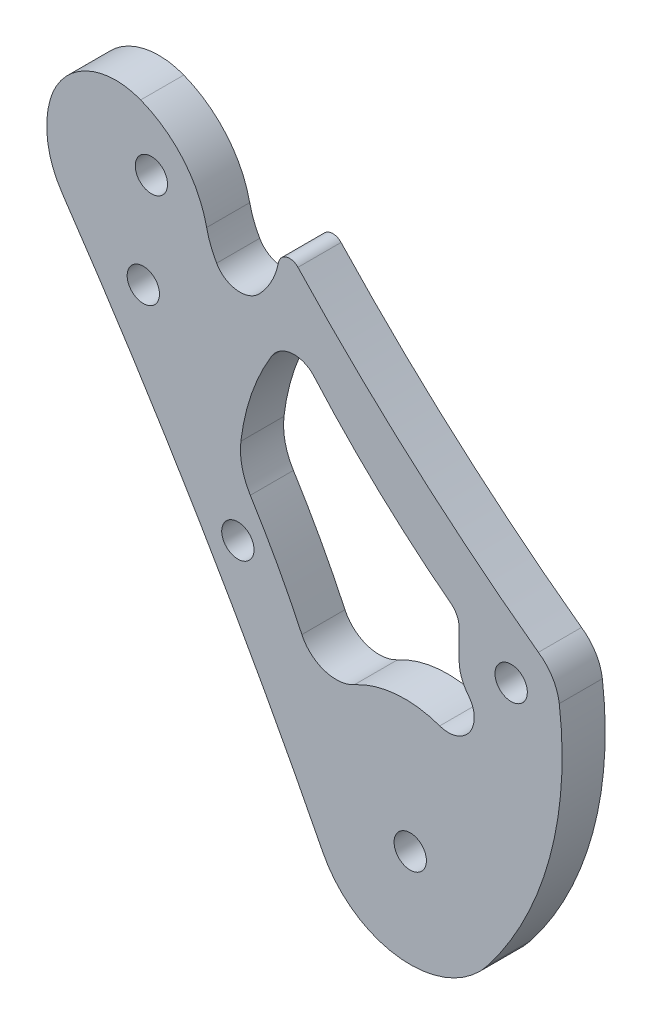
ISO-10303-21;
HEADER;
FILE_DESCRIPTION(('STEP AP214'),'2;1');
FILE_NAME('part.step','',(''),(''),'','','');
FILE_SCHEMA(('AUTOMOTIVE_DESIGN { 1 0 10303 214 1 1 1 1 }'));
ENDSEC;
DATA;
#1=APPLICATION_CONTEXT('core data for automotive mechanical design processes');
#2=APPLICATION_PROTOCOL_DEFINITION('international standard','automotive_design',2000,#1);
#3=PRODUCT_CONTEXT('',#1,'mechanical');
#4=PRODUCT('Part','Part','',(#3));
#5=PRODUCT_RELATED_PRODUCT_CATEGORY('part','',(#4));
#6=PRODUCT_DEFINITION_FORMATION('','',#4);
#7=PRODUCT_DEFINITION_CONTEXT('part definition',#1,'design');
#8=PRODUCT_DEFINITION('design','',#6,#7);
#9=PRODUCT_DEFINITION_SHAPE('','',#8);
#10=(LENGTH_UNIT() NAMED_UNIT(*) SI_UNIT(.MILLI.,.METRE.));
#11=(NAMED_UNIT(*) PLANE_ANGLE_UNIT() SI_UNIT($,.RADIAN.));
#12=(NAMED_UNIT(*) SI_UNIT($,.STERADIAN.) SOLID_ANGLE_UNIT());
#13=UNCERTAINTY_MEASURE_WITH_UNIT(LENGTH_MEASURE(1.E-05),#10,'distance_accuracy_value','');
#14=(GEOMETRIC_REPRESENTATION_CONTEXT(3) GLOBAL_UNCERTAINTY_ASSIGNED_CONTEXT((#13)) GLOBAL_UNIT_ASSIGNED_CONTEXT((#10,
#11,#12)) REPRESENTATION_CONTEXT('',''));
#15=CARTESIAN_POINT('',(0.,0.,0.));
#16=DIRECTION('',(0.,0.,1.));
#17=DIRECTION('',(1.,0.,0.));
#18=AXIS2_PLACEMENT_3D('',#15,#16,#17);
#19=CARTESIAN_POINT('',(65.9573973429245,54.9204086628335,4.));
#20=DIRECTION('',(0.,0.,-1.));
#21=DIRECTION('',(-1.,0.,0.));
#22=AXIS2_PLACEMENT_3D('',#19,#20,#21);
#23=PLANE('',#22);
#24=CARTESIAN_POINT('',(76.3123714532048,30.2000942948942,4.));
#25=DIRECTION('',(0.,0.,1.));
#26=DIRECTION('',(1.,0.,0.));
#27=AXIS2_PLACEMENT_3D('',#24,#25,#26);
#28=CIRCLE('',#27,1.5);
#29=CARTESIAN_POINT('',(77.8123714532048,30.2000942948942,4.));
#30=VERTEX_POINT('',#29);
#31=EDGE_CURVE('E239',#30,#30,#28,.T.);
#32=ORIENTED_EDGE('',*,*,#31,.F.);
#33=EDGE_LOOP('',(#32));
#34=FACE_BOUND('',#33,.T.);
#35=CARTESIAN_POINT('',(67.5354671080567,46.360427952564,4.));
#36=DIRECTION('',(0.,0.,1.));
#37=DIRECTION('',(1.,0.,0.));
#38=AXIS2_PLACEMENT_3D('',#35,#36,#37);
#39=CIRCLE('',#38,1.50110642000384);
#40=CARTESIAN_POINT('',(69.0365735280606,46.360427952564,4.));
#41=VERTEX_POINT('',#40);
#42=EDGE_CURVE('E284',#41,#41,#39,.T.);
#43=ORIENTED_EDGE('',*,*,#42,.F.);
#44=EDGE_LOOP('',(#43));
#45=FACE_BOUND('',#44,.T.);
#46=CARTESIAN_POINT('',(92.3123714532048,13.2000942948942,4.));
#47=DIRECTION('',(0.,0.,1.));
#48=DIRECTION('',(1.,0.,0.));
#49=AXIS2_PLACEMENT_3D('',#46,#47,#48);
#50=CIRCLE('',#49,1.5);
#51=CARTESIAN_POINT('',(93.8123714532048,13.2000942948942,4.));
#52=VERTEX_POINT('',#51);
#53=EDGE_CURVE('E290',#52,#52,#50,.T.);
#54=ORIENTED_EDGE('',*,*,#53,.F.);
#55=EDGE_LOOP('',(#54));
#56=FACE_BOUND('',#55,.T.);
#57=CARTESIAN_POINT('',(101.682075095834,31.4335430539551,4.));
#58=DIRECTION('',(0.,0.,1.));
#59=DIRECTION('',(1.,0.,0.));
#60=AXIS2_PLACEMENT_3D('',#57,#58,#59);
#61=CIRCLE('',#60,1.5);
#62=CARTESIAN_POINT('',(103.182075095834,31.4335430539551,4.));
#63=VERTEX_POINT('',#62);
#64=EDGE_CURVE('E296',#63,#63,#61,.T.);
#65=ORIENTED_EDGE('',*,*,#64,.F.);
#66=EDGE_LOOP('',(#65));
#67=FACE_BOUND('',#66,.T.);
#68=CARTESIAN_POINT('',(68.2854671080567,55.560427952564,4.));
#69=DIRECTION('',(0.,0.,1.));
#70=DIRECTION('',(1.,0.,0.));
#71=AXIS2_PLACEMENT_3D('',#68,#69,#70);
#72=CIRCLE('',#71,1.5);
#73=CARTESIAN_POINT('',(69.7854671080567,55.560427952564,4.));
#74=VERTEX_POINT('',#73);
#75=EDGE_CURVE('E302',#74,#74,#72,.T.);
#76=ORIENTED_EDGE('',*,*,#75,.F.);
#77=EDGE_LOOP('',(#76));
#78=FACE_BOUND('',#77,.T.);
#79=CARTESIAN_POINT('',(66.9297595318174,54.6414005412217,4.));
#80=DIRECTION('',(0.,0.,1.));
#81=DIRECTION('',(-1.,0.,0.));
#82=AXIS2_PLACEMENT_3D('',#79,#80,#81);
#83=CIRCLE('',#82,8.36216252942286);
#84=CARTESIAN_POINT('',(58.8919443420734,56.9477589574275,4.));
#85=VERTEX_POINT('',#84);
#86=CARTESIAN_POINT('',(60.0269446482824,49.9215585044443,4.));
#87=VERTEX_POINT('',#86);
#88=EDGE_CURVE('E308',#85,#87,#83,.T.);
#89=ORIENTED_EDGE('',*,*,#88,.T.);
#90=CARTESIAN_POINT('',(-239.950657402607,-155.189967755456,4.));
#91=DIRECTION('',(0.,0.,-1.));
#92=DIRECTION('',(-1.,0.,0.));
#93=AXIS2_PLACEMENT_3D('',#90,#91,#92);
#94=CIRCLE('',#93,363.396890378643);
#95=CARTESIAN_POINT('',(84.1952739936411,9.086369847153,4.));
#96=VERTEX_POINT('',#95);
#97=EDGE_CURVE('E311',#87,#96,#94,.T.);
#98=ORIENTED_EDGE('',*,*,#97,.T.);
#99=CARTESIAN_POINT('',(92.3123714532048,13.2000942948942,4.));
#100=DIRECTION('',(0.,0.,1.));
#101=DIRECTION('',(1.,0.,0.));
#102=AXIS2_PLACEMENT_3D('',#99,#100,#101);
#103=CIRCLE('',#102,9.09999999999997);
#104=CARTESIAN_POINT('',(99.5090678289681,7.63075310629086,4.));
#105=VERTEX_POINT('',#104);
#106=EDGE_CURVE('E314',#96,#105,#103,.T.);
#107=ORIENTED_EDGE('',*,*,#106,.T.);
#108=CARTESIAN_POINT('',(73.4111578948811,27.8272651089185,4.));
#109=DIRECTION('',(0.,0.,1.));
#110=DIRECTION('',(1.,0.,0.));
#111=AXIS2_PLACEMENT_3D('',#108,#109,#110);
#112=CIRCLE('',#111,33.);
#113=CARTESIAN_POINT('',(106.145904127564,32.0029553610661,4.));
#114=VERTEX_POINT('',#113);
#115=EDGE_CURVE('E316',#105,#114,#112,.T.);
#116=ORIENTED_EDGE('',*,*,#115,.T.);
#117=CARTESIAN_POINT('',(101.682075095834,31.4335430539551,4.));
#118=DIRECTION('',(0.,0.,1.));
#119=DIRECTION('',(1.,0.,0.));
#120=AXIS2_PLACEMENT_3D('',#117,#118,#119);
#121=CIRCLE('',#120,4.49999999999999);
#122=CARTESIAN_POINT('',(104.210334732775,35.1561635299391,4.));
#123=VERTEX_POINT('',#122);
#124=EDGE_CURVE('E318',#114,#123,#121,.T.);
#125=ORIENTED_EDGE('',*,*,#124,.T.);
#126=CARTESIAN_POINT('',(199.067313338011,164.628673960799,4.));
#127=DIRECTION('',(0.,0.,-1.));
#128=DIRECTION('',(1.,0.,0.));
#129=AXIS2_PLACEMENT_3D('',#126,#127,#128);
#130=CIRCLE('',#129,160.502265863704);
#131=CARTESIAN_POINT('',(81.8891880193831,54.9461124745023,4.));
#132=VERTEX_POINT('',#131);
#133=EDGE_CURVE('E320',#123,#132,#130,.T.);
#134=ORIENTED_EDGE('',*,*,#133,.T.);
#135=CARTESIAN_POINT('',(81.1196021658387,54.2257549208134,4.));
#136=DIRECTION('',(0.,0.,1.));
#137=DIRECTION('',(-1.,0.,0.));
#138=AXIS2_PLACEMENT_3D('',#135,#136,#137);
#139=CIRCLE('',#138,1.05412399229522);
#140=CARTESIAN_POINT('',(80.0854515846548,54.4299851011725,4.));
#141=VERTEX_POINT('',#140);
#142=EDGE_CURVE('E322',#132,#141,#139,.T.);
#143=ORIENTED_EDGE('',*,*,#142,.T.);
#144=CARTESIAN_POINT('',(73.4029266984942,55.7496896853854,4.));
#145=DIRECTION('',(0.,0.,-1.));
#146=DIRECTION('',(1.,0.,0.));
#147=AXIS2_PLACEMENT_3D('',#144,#145,#146);
#148=CIRCLE('',#147,6.81159005253174);
#149=CARTESIAN_POINT('',(78.3014947298892,51.016636729254,4.));
#150=VERTEX_POINT('',#149);
#151=EDGE_CURVE('E324',#141,#150,#148,.T.);
#152=ORIENTED_EDGE('',*,*,#151,.T.);
#153=CARTESIAN_POINT('',(76.5036149420508,52.7537689258592,4.));
#154=DIRECTION('',(0.,0.,-1.));
#155=DIRECTION('',(1.,0.,0.));
#156=AXIS2_PLACEMENT_3D('',#153,#154,#155);
#157=CIRCLE('',#156,2.49999999999999);
#158=CARTESIAN_POINT('',(74.3377170480334,51.5052152375098,4.));
#159=VERTEX_POINT('',#158);
#160=EDGE_CURVE('E326',#150,#159,#157,.T.);
#161=ORIENTED_EDGE('',*,*,#160,.T.);
#162=CARTESIAN_POINT('',(81.5329294190427,55.6529679866559,4.));
#163=DIRECTION('',(0.,0.,-1.));
#164=DIRECTION('',(1.,0.,0.));
#165=AXIS2_PLACEMENT_3D('',#162,#163,#164);
#166=CIRCLE('',#165,8.30511492587398);
#167=CARTESIAN_POINT('',(73.4129652285897,53.9090885533994,4.));
#168=VERTEX_POINT('',#167);
#169=EDGE_CURVE('E328',#159,#168,#166,.T.);
#170=ORIENTED_EDGE('',*,*,#169,.T.);
#171=CARTESIAN_POINT('',(63.6629777816389,51.8151381141552,4.));
#172=DIRECTION('',(0.,0.,1.));
#173=DIRECTION('',(-1.,0.,0.));
#174=AXIS2_PLACEMENT_3D('',#171,#172,#173);
#175=CIRCLE('',#174,9.97230583454543);
#176=CARTESIAN_POINT('',(67.2915815817182,61.1038472881879,4.));
#177=VERTEX_POINT('',#176);
#178=EDGE_CURVE('E330',#168,#177,#175,.T.);
#179=ORIENTED_EDGE('',*,*,#178,.T.);
#180=CARTESIAN_POINT('',(64.9850351540316,55.1994167844453,4.));
#181=DIRECTION('',(0.,0.,1.));
#182=DIRECTION('',(-1.,0.,0.));
#183=AXIS2_PLACEMENT_3D('',#180,#181,#182);
#184=CIRCLE('',#183,6.33896332191618);
#185=EDGE_CURVE('E332',#177,#85,#184,.T.);
#186=ORIENTED_EDGE('',*,*,#185,.T.);
#187=EDGE_LOOP('',(#89,#98,#107,#116,#125,#134,#143,#152,#161,#170,#179,#186));
#188=FACE_BOUND('',#187,.T.);
#189=CARTESIAN_POINT('',(82.6003377734058,37.6113987415421,4.));
#190=DIRECTION('',(0.,0.,1.));
#191=DIRECTION('',(1.,0.,0.));
#192=AXIS2_PLACEMENT_3D('',#189,#190,#191);
#193=CIRCLE('',#192,6.04988415179236);
#194=CARTESIAN_POINT('',(76.5917089679829,38.3167200362377,4.));
#195=VERTEX_POINT('',#194);
#196=CARTESIAN_POINT('',(77.4671539045136,34.4095989947975,4.));
#197=VERTEX_POINT('',#196);
#198=EDGE_CURVE('E196',#195,#197,#193,.T.);
#199=ORIENTED_EDGE('',*,*,#198,.F.);
#200=CARTESIAN_POINT('',(96.9243505215598,35.9299783136989,4.));
#201=DIRECTION('',(0.,0.,1.));
#202=DIRECTION('',(1.,0.,0.));
#203=AXIS2_PLACEMENT_3D('',#200,#201,#202);
#204=CIRCLE('',#203,20.4722458122296);
#205=CARTESIAN_POINT('',(79.4458109725354,46.5889418575684,4.));
#206=VERTEX_POINT('',#205);
#207=EDGE_CURVE('E236',#206,#195,#204,.T.);
#208=ORIENTED_EDGE('',*,*,#207,.F.);
#209=CARTESIAN_POINT('',(81.5347627293735,45.315033327706,4.));
#210=DIRECTION('',(0.,0.,1.));
#211=DIRECTION('',(1.,0.,0.));
#212=AXIS2_PLACEMENT_3D('',#209,#210,#211);
#213=CIRCLE('',#212,2.44674526358041);
#214=CARTESIAN_POINT('',(83.3729221409373,46.9298808011637,4.));
#215=VERTEX_POINT('',#214);
#216=EDGE_CURVE('E234',#215,#206,#213,.T.);
#217=ORIENTED_EDGE('',*,*,#216,.F.);
#218=CARTESIAN_POINT('',(150.51265424025,105.913027783483,4.));
#219=DIRECTION('',(0.,0.,-1.));
#220=DIRECTION('',(-1.,0.,0.));
#221=AXIS2_PLACEMENT_3D('',#218,#219,#220);
#222=CIRCLE('',#221,89.3686480501152);
#223=CARTESIAN_POINT('',(96.0817946008957,35.0325877931282,4.));
#224=VERTEX_POINT('',#223);
#225=EDGE_CURVE('E232',#224,#215,#222,.T.);
#226=ORIENTED_EDGE('',*,*,#225,.F.);
#227=CARTESIAN_POINT('',(94.8854159392447,33.4746508710447,4.));
#228=DIRECTION('',(0.,0.,1.));
#229=DIRECTION('',(1.,0.,0.));
#230=AXIS2_PLACEMENT_3D('',#227,#228,#229);
#231=CIRCLE('',#230,1.9643037838493);
#232=CARTESIAN_POINT('',(96.849719723094,33.4746508710447,4.));
#233=VERTEX_POINT('',#232);
#234=EDGE_CURVE('E230',#233,#224,#231,.T.);
#235=ORIENTED_EDGE('',*,*,#234,.F.);
#236=DIRECTION('',(0.,1.,0.));
#237=VECTOR('',#236,1.);
#238=CARTESIAN_POINT('',(96.849719723094,30.8489992327096,4.));
#239=LINE('',#238,#237);
#240=CARTESIAN_POINT('',(96.849719723094,30.8489992327096,4.));
#241=VERTEX_POINT('',#240);
#242=EDGE_CURVE('E228',#241,#233,#239,.T.);
#243=ORIENTED_EDGE('',*,*,#242,.F.);
#244=CARTESIAN_POINT('',(100.644803888709,30.8489992327096,4.));
#245=DIRECTION('',(0.,0.,-1.));
#246=DIRECTION('',(-1.,0.,0.));
#247=AXIS2_PLACEMENT_3D('',#244,#245,#246);
#248=CIRCLE('',#247,3.79508416561466);
#249=CARTESIAN_POINT('',(97.7092386530645,28.4437714739773,4.));
#250=VERTEX_POINT('',#249);
#251=EDGE_CURVE('E226',#250,#241,#248,.T.);
#252=ORIENTED_EDGE('',*,*,#251,.F.);
#253=CARTESIAN_POINT('',(95.8535239103705,26.9233090576697,4.));
#254=DIRECTION('',(0.,0.,1.));
#255=DIRECTION('',(1.,0.,0.));
#256=AXIS2_PLACEMENT_3D('',#253,#254,#255);
#257=CIRCLE('',#256,2.39905880829459);
#258=CARTESIAN_POINT('',(95.0511730238912,24.6623985727938,4.));
#259=VERTEX_POINT('',#258);
#260=EDGE_CURVE('E224',#259,#250,#257,.T.);
#261=ORIENTED_EDGE('',*,*,#260,.F.);
#262=CARTESIAN_POINT('',(91.8101069202838,15.5295360567749,4.));
#263=DIRECTION('',(0.,0.,-1.));
#264=DIRECTION('',(-1.,0.,0.));
#265=AXIS2_PLACEMENT_3D('',#262,#263,#264);
#266=CIRCLE('',#265,9.69090745103137);
#267=CARTESIAN_POINT('',(87.1342363780843,24.0177585972745,4.));
#268=VERTEX_POINT('',#267);
#269=EDGE_CURVE('E219',#268,#259,#266,.T.);
#270=ORIENTED_EDGE('',*,*,#269,.F.);
#271=CARTESIAN_POINT('',(85.4377471522733,27.0974371205104,4.));
#272=DIRECTION('',(0.,0.,1.));
#273=DIRECTION('',(1.,0.,0.));
#274=AXIS2_PLACEMENT_3D('',#271,#272,#273);
#275=CIRCLE('',#274,3.51603405839208);
#276=CARTESIAN_POINT('',(82.254048976086,25.6052704332014,4.));
#277=VERTEX_POINT('',#276);
#278=EDGE_CURVE('E217',#277,#268,#275,.T.);
#279=ORIENTED_EDGE('',*,*,#278,.F.);
#280=CARTESIAN_POINT('',(6.21597439059316,-10.0329953773693,4.));
#281=DIRECTION('',(0.,0.,-1.));
#282=DIRECTION('',(-1.,0.,0.));
#283=AXIS2_PLACEMENT_3D('',#280,#281,#282);
#284=CIRCLE('',#283,83.9754415091333);
#285=EDGE_CURVE('E204',#197,#277,#284,.T.);
#286=ORIENTED_EDGE('',*,*,#285,.F.);
#287=EDGE_LOOP('',(#199,#208,#217,#226,#235,#243,#252,#261,#270,#279,#286));
#288=FACE_BOUND('',#287,.T.);
#289=ADVANCED_FACE('F41',(#34,#45,#56,#67,#78,#188,#288),#23,.F.);
#290=CARTESIAN_POINT('',(65.9573973429245,54.9204086628335,0.));
#291=DIRECTION('',(0.,0.,-1.));
#292=DIRECTION('',(-1.,0.,0.));
#293=AXIS2_PLACEMENT_3D('',#290,#291,#292);
#294=PLANE('',#293);
#295=CARTESIAN_POINT('',(76.3123714532048,30.2000942948942,0.));
#296=DIRECTION('',(0.,0.,-1.));
#297=DIRECTION('',(-1.,0.,0.));
#298=AXIS2_PLACEMENT_3D('',#295,#296,#297);
#299=CIRCLE('',#298,1.5);
#300=CARTESIAN_POINT('',(74.8123714532047,30.2000942948942,0.));
#301=VERTEX_POINT('',#300);
#302=EDGE_CURVE('E720',#301,#301,#299,.F.);
#303=ORIENTED_EDGE('',*,*,#302,.T.);
#304=EDGE_LOOP('',(#303));
#305=FACE_BOUND('',#304,.T.);
#306=CARTESIAN_POINT('',(92.3123714532048,13.2000942948942,0.));
#307=DIRECTION('',(0.,0.,1.));
#308=DIRECTION('',(1.,0.,0.));
#309=AXIS2_PLACEMENT_3D('',#306,#307,#308);
#310=CIRCLE('',#309,1.5);
#311=CARTESIAN_POINT('',(93.8123714532048,13.2000942948942,0.));
#312=VERTEX_POINT('',#311);
#313=EDGE_CURVE('E287',#312,#312,#310,.T.);
#314=ORIENTED_EDGE('',*,*,#313,.T.);
#315=EDGE_LOOP('',(#314));
#316=FACE_BOUND('',#315,.T.);
#317=CARTESIAN_POINT('',(68.2854671080567,55.560427952564,0.));
#318=DIRECTION('',(0.,0.,1.));
#319=DIRECTION('',(1.,0.,0.));
#320=AXIS2_PLACEMENT_3D('',#317,#318,#319);
#321=CIRCLE('',#320,1.5);
#322=CARTESIAN_POINT('',(69.7854671080567,55.560427952564,0.));
#323=VERTEX_POINT('',#322);
#324=EDGE_CURVE('E299',#323,#323,#321,.T.);
#325=ORIENTED_EDGE('',*,*,#324,.T.);
#326=EDGE_LOOP('',(#325));
#327=FACE_BOUND('',#326,.T.);
#328=CARTESIAN_POINT('',(66.9297595318174,54.6414005412217,0.));
#329=DIRECTION('',(0.,0.,1.));
#330=DIRECTION('',(-1.,0.,0.));
#331=AXIS2_PLACEMENT_3D('',#328,#329,#330);
#332=CIRCLE('',#331,8.36216252942286);
#333=CARTESIAN_POINT('',(58.8919443420734,56.9477589574275,0.));
#334=VERTEX_POINT('',#333);
#335=CARTESIAN_POINT('',(60.0269446482824,49.9215585044443,0.));
#336=VERTEX_POINT('',#335);
#337=EDGE_CURVE('E305',#334,#336,#332,.T.);
#338=ORIENTED_EDGE('',*,*,#337,.F.);
#339=CARTESIAN_POINT('',(64.9850351540316,55.1994167844453,0.));
#340=DIRECTION('',(0.,0.,1.));
#341=DIRECTION('',(-1.,0.,0.));
#342=AXIS2_PLACEMENT_3D('',#339,#340,#341);
#343=CIRCLE('',#342,6.33896332191618);
#344=CARTESIAN_POINT('',(67.2915815817182,61.1038472881879,0.));
#345=VERTEX_POINT('',#344);
#346=EDGE_CURVE('E312',#345,#334,#343,.T.);
#347=ORIENTED_EDGE('',*,*,#346,.F.);
#348=CARTESIAN_POINT('',(63.6629777816389,51.8151381141552,0.));
#349=DIRECTION('',(0.,0.,1.));
#350=DIRECTION('',(-1.,0.,0.));
#351=AXIS2_PLACEMENT_3D('',#348,#349,#350);
#352=CIRCLE('',#351,9.97230583454543);
#353=CARTESIAN_POINT('',(73.4129652285897,53.9090885533994,0.));
#354=VERTEX_POINT('',#353);
#355=EDGE_CURVE('E355',#354,#345,#352,.T.);
#356=ORIENTED_EDGE('',*,*,#355,.F.);
#357=CARTESIAN_POINT('',(81.5329294190427,55.6529679866559,0.));
#358=DIRECTION('',(0.,0.,-1.));
#359=DIRECTION('',(1.,0.,0.));
#360=AXIS2_PLACEMENT_3D('',#357,#358,#359);
#361=CIRCLE('',#360,8.30511492587398);
#362=CARTESIAN_POINT('',(74.3377170480334,51.5052152375098,0.));
#363=VERTEX_POINT('',#362);
#364=EDGE_CURVE('E353',#363,#354,#361,.T.);
#365=ORIENTED_EDGE('',*,*,#364,.F.);
#366=CARTESIAN_POINT('',(76.5036149420508,52.7537689258592,0.));
#367=DIRECTION('',(0.,0.,-1.));
#368=DIRECTION('',(1.,0.,0.));
#369=AXIS2_PLACEMENT_3D('',#366,#367,#368);
#370=CIRCLE('',#369,2.49999999999999);
#371=CARTESIAN_POINT('',(78.3014947298892,51.016636729254,0.));
#372=VERTEX_POINT('',#371);
#373=EDGE_CURVE('E351',#372,#363,#370,.T.);
#374=ORIENTED_EDGE('',*,*,#373,.F.);
#375=CARTESIAN_POINT('',(73.4029266984942,55.7496896853854,0.));
#376=DIRECTION('',(0.,0.,-1.));
#377=DIRECTION('',(1.,0.,0.));
#378=AXIS2_PLACEMENT_3D('',#375,#376,#377);
#379=CIRCLE('',#378,6.81159005253174);
#380=CARTESIAN_POINT('',(80.0854515846548,54.4299851011725,0.));
#381=VERTEX_POINT('',#380);
#382=EDGE_CURVE('E349',#381,#372,#379,.T.);
#383=ORIENTED_EDGE('',*,*,#382,.F.);
#384=CARTESIAN_POINT('',(81.1196021658387,54.2257549208134,0.));
#385=DIRECTION('',(0.,0.,1.));
#386=DIRECTION('',(-1.,0.,0.));
#387=AXIS2_PLACEMENT_3D('',#384,#385,#386);
#388=CIRCLE('',#387,1.05412399229522);
#389=CARTESIAN_POINT('',(81.8891880193831,54.9461124745023,0.));
#390=VERTEX_POINT('',#389);
#391=EDGE_CURVE('E347',#390,#381,#388,.T.);
#392=ORIENTED_EDGE('',*,*,#391,.F.);
#393=CARTESIAN_POINT('',(199.067313338011,164.628673960799,0.));
#394=DIRECTION('',(0.,0.,-1.));
#395=DIRECTION('',(1.,0.,0.));
#396=AXIS2_PLACEMENT_3D('',#393,#394,#395);
#397=CIRCLE('',#396,160.502265863704);
#398=CARTESIAN_POINT('',(104.210334732775,35.1561635299391,0.));
#399=VERTEX_POINT('',#398);
#400=EDGE_CURVE('E345',#399,#390,#397,.T.);
#401=ORIENTED_EDGE('',*,*,#400,.F.);
#402=CARTESIAN_POINT('',(101.682075095834,31.4335430539551,0.));
#403=DIRECTION('',(0.,0.,1.));
#404=DIRECTION('',(1.,0.,0.));
#405=AXIS2_PLACEMENT_3D('',#402,#403,#404);
#406=CIRCLE('',#405,4.49999999999999);
#407=CARTESIAN_POINT('',(106.145904127564,32.0029553610661,0.));
#408=VERTEX_POINT('',#407);
#409=EDGE_CURVE('E343',#408,#399,#406,.T.);
#410=ORIENTED_EDGE('',*,*,#409,.F.);
#411=CARTESIAN_POINT('',(73.4111578948811,27.8272651089185,0.));
#412=DIRECTION('',(0.,0.,1.));
#413=DIRECTION('',(1.,0.,0.));
#414=AXIS2_PLACEMENT_3D('',#411,#412,#413);
#415=CIRCLE('',#414,33.);
#416=CARTESIAN_POINT('',(99.5090678289681,7.63075310629086,0.));
#417=VERTEX_POINT('',#416);
#418=EDGE_CURVE('E341',#417,#408,#415,.T.);
#419=ORIENTED_EDGE('',*,*,#418,.F.);
#420=CARTESIAN_POINT('',(92.3123714532048,13.2000942948942,0.));
#421=DIRECTION('',(0.,0.,1.));
#422=DIRECTION('',(1.,0.,0.));
#423=AXIS2_PLACEMENT_3D('',#420,#421,#422);
#424=CIRCLE('',#423,9.09999999999997);
#425=CARTESIAN_POINT('',(84.1952739936411,9.086369847153,0.));
#426=VERTEX_POINT('',#425);
#427=EDGE_CURVE('E339',#426,#417,#424,.T.);
#428=ORIENTED_EDGE('',*,*,#427,.F.);
#429=CARTESIAN_POINT('',(-239.950657402607,-155.189967755456,0.));
#430=DIRECTION('',(0.,0.,-1.));
#431=DIRECTION('',(-1.,0.,0.));
#432=AXIS2_PLACEMENT_3D('',#429,#430,#431);
#433=CIRCLE('',#432,363.396890378643);
#434=EDGE_CURVE('E337',#336,#426,#433,.T.);
#435=ORIENTED_EDGE('',*,*,#434,.F.);
#436=EDGE_LOOP('',(#338,#347,#356,#365,#374,#383,#392,#401,#410,#419,#428,#435));
#437=FACE_BOUND('',#436,.T.);
#438=CARTESIAN_POINT('',(101.682075095834,31.4335430539551,0.));
#439=DIRECTION('',(0.,0.,1.));
#440=DIRECTION('',(1.,0.,0.));
#441=AXIS2_PLACEMENT_3D('',#438,#439,#440);
#442=CIRCLE('',#441,1.5);
#443=CARTESIAN_POINT('',(103.182075095834,31.4335430539551,0.));
#444=VERTEX_POINT('',#443);
#445=EDGE_CURVE('E293',#444,#444,#442,.T.);
#446=ORIENTED_EDGE('',*,*,#445,.T.);
#447=EDGE_LOOP('',(#446));
#448=FACE_BOUND('',#447,.T.);
#449=CARTESIAN_POINT('',(67.5354671080567,46.360427952564,0.));
#450=DIRECTION('',(0.,0.,1.));
#451=DIRECTION('',(1.,0.,0.));
#452=AXIS2_PLACEMENT_3D('',#449,#450,#451);
#453=CIRCLE('',#452,1.50110642000384);
#454=CARTESIAN_POINT('',(69.0365735280606,46.360427952564,0.));
#455=VERTEX_POINT('',#454);
#456=EDGE_CURVE('E212',#455,#455,#453,.T.);
#457=ORIENTED_EDGE('',*,*,#456,.T.);
#458=EDGE_LOOP('',(#457));
#459=FACE_BOUND('',#458,.T.);
#460=CARTESIAN_POINT('',(96.9243505215598,35.9299783136989,0.));
#461=DIRECTION('',(0.,0.,1.));
#462=DIRECTION('',(1.,0.,0.));
#463=AXIS2_PLACEMENT_3D('',#460,#461,#462);
#464=CIRCLE('',#463,20.4722458122296);
#465=CARTESIAN_POINT('',(79.4458109725354,46.5889418575684,0.));
#466=VERTEX_POINT('',#465);
#467=CARTESIAN_POINT('',(76.5917089679829,38.3167200362377,0.));
#468=VERTEX_POINT('',#467);
#469=EDGE_CURVE('E205',#466,#468,#464,.T.);
#470=ORIENTED_EDGE('',*,*,#469,.T.);
#471=CARTESIAN_POINT('',(82.6003377734058,37.6113987415421,0.));
#472=DIRECTION('',(0.,0.,1.));
#473=DIRECTION('',(1.,0.,0.));
#474=AXIS2_PLACEMENT_3D('',#471,#472,#473);
#475=CIRCLE('',#474,6.04988415179236);
#476=CARTESIAN_POINT('',(77.4671539045136,34.4095989947975,0.));
#477=VERTEX_POINT('',#476);
#478=EDGE_CURVE('E64',#468,#477,#475,.T.);
#479=ORIENTED_EDGE('',*,*,#478,.T.);
#480=CARTESIAN_POINT('',(6.21597439059316,-10.0329953773693,0.));
#481=DIRECTION('',(0.,0.,-1.));
#482=DIRECTION('',(-1.,0.,0.));
#483=AXIS2_PLACEMENT_3D('',#480,#481,#482);
#484=CIRCLE('',#483,83.9754415091333);
#485=CARTESIAN_POINT('',(82.254048976086,25.6052704332014,0.));
#486=VERTEX_POINT('',#485);
#487=EDGE_CURVE('E211',#477,#486,#484,.T.);
#488=ORIENTED_EDGE('',*,*,#487,.T.);
#489=CARTESIAN_POINT('',(85.4377471522733,27.0974371205104,0.));
#490=DIRECTION('',(0.,0.,1.));
#491=DIRECTION('',(1.,0.,0.));
#492=AXIS2_PLACEMENT_3D('',#489,#490,#491);
#493=CIRCLE('',#492,3.51603405839208);
#494=CARTESIAN_POINT('',(87.1342363780843,24.0177585972745,0.));
#495=VERTEX_POINT('',#494);
#496=EDGE_CURVE('E241',#486,#495,#493,.T.);
#497=ORIENTED_EDGE('',*,*,#496,.T.);
#498=CARTESIAN_POINT('',(91.8101069202838,15.5295360567749,0.));
#499=DIRECTION('',(0.,0.,-1.));
#500=DIRECTION('',(-1.,0.,0.));
#501=AXIS2_PLACEMENT_3D('',#498,#499,#500);
#502=CIRCLE('',#501,9.69090745103137);
#503=CARTESIAN_POINT('',(95.0511730238912,24.6623985727938,0.));
#504=VERTEX_POINT('',#503);
#505=EDGE_CURVE('E244',#495,#504,#502,.T.);
#506=ORIENTED_EDGE('',*,*,#505,.T.);
#507=CARTESIAN_POINT('',(95.8535239103705,26.9233090576697,0.));
#508=DIRECTION('',(0.,0.,1.));
#509=DIRECTION('',(1.,0.,0.));
#510=AXIS2_PLACEMENT_3D('',#507,#508,#509);
#511=CIRCLE('',#510,2.39905880829459);
#512=CARTESIAN_POINT('',(97.7092386530645,28.4437714739773,0.));
#513=VERTEX_POINT('',#512);
#514=EDGE_CURVE('E247',#504,#513,#511,.T.);
#515=ORIENTED_EDGE('',*,*,#514,.T.);
#516=CARTESIAN_POINT('',(100.644803888709,30.8489992327096,0.));
#517=DIRECTION('',(0.,0.,-1.));
#518=DIRECTION('',(-1.,0.,0.));
#519=AXIS2_PLACEMENT_3D('',#516,#517,#518);
#520=CIRCLE('',#519,3.79508416561466);
#521=CARTESIAN_POINT('',(96.849719723094,30.8489992327096,0.));
#522=VERTEX_POINT('',#521);
#523=EDGE_CURVE('E250',#513,#522,#520,.T.);
#524=ORIENTED_EDGE('',*,*,#523,.T.);
#525=DIRECTION('',(0.,1.,0.));
#526=VECTOR('',#525,1.);
#527=CARTESIAN_POINT('',(96.849719723094,30.8489992327096,0.));
#528=LINE('',#527,#526);
#529=CARTESIAN_POINT('',(96.849719723094,33.4746508710447,0.));
#530=VERTEX_POINT('',#529);
#531=EDGE_CURVE('E253',#522,#530,#528,.T.);
#532=ORIENTED_EDGE('',*,*,#531,.T.);
#533=CARTESIAN_POINT('',(94.8854159392447,33.4746508710447,0.));
#534=DIRECTION('',(0.,0.,1.));
#535=DIRECTION('',(1.,0.,0.));
#536=AXIS2_PLACEMENT_3D('',#533,#534,#535);
#537=CIRCLE('',#536,1.9643037838493);
#538=CARTESIAN_POINT('',(96.0817946008957,35.0325877931282,0.));
#539=VERTEX_POINT('',#538);
#540=EDGE_CURVE('E256',#530,#539,#537,.T.);
#541=ORIENTED_EDGE('',*,*,#540,.T.);
#542=CARTESIAN_POINT('',(150.51265424025,105.913027783483,0.));
#543=DIRECTION('',(0.,0.,-1.));
#544=DIRECTION('',(-1.,0.,0.));
#545=AXIS2_PLACEMENT_3D('',#542,#543,#544);
#546=CIRCLE('',#545,89.3686480501152);
#547=CARTESIAN_POINT('',(83.3729221409373,46.9298808011637,0.));
#548=VERTEX_POINT('',#547);
#549=EDGE_CURVE('E259',#539,#548,#546,.T.);
#550=ORIENTED_EDGE('',*,*,#549,.T.);
#551=CARTESIAN_POINT('',(81.5347627293735,45.315033327706,0.));
#552=DIRECTION('',(0.,0.,1.));
#553=DIRECTION('',(1.,0.,0.));
#554=AXIS2_PLACEMENT_3D('',#551,#552,#553);
#555=CIRCLE('',#554,2.44674526358041);
#556=EDGE_CURVE('E262',#548,#466,#555,.T.);
#557=ORIENTED_EDGE('',*,*,#556,.T.);
#558=EDGE_LOOP('',(#470,#479,#488,#497,#506,#515,#524,#532,#541,#550,#557));
#559=FACE_BOUND('',#558,.T.);
#560=ADVANCED_FACE('F397',(#305,#316,#327,#437,#448,#459,#559),#294,.T.);
#561=CARTESIAN_POINT('',(66.9297595318174,54.6414005412217,4.));
#562=DIRECTION('',(0.,0.,-1.));
#563=DIRECTION('',(-1.,0.,0.));
#564=AXIS2_PLACEMENT_3D('',#561,#562,#563);
#565=CYLINDRICAL_SURFACE('',#564,8.36216252942286);
#566=ORIENTED_EDGE('',*,*,#337,.T.);
#567=DIRECTION('',(0.,0.,-1.));
#568=VECTOR('',#567,1.);
#569=CARTESIAN_POINT('',(60.0269446482824,49.9215585044443,4.));
#570=LINE('',#569,#568);
#571=EDGE_CURVE('E11',#87,#336,#570,.T.);
#572=ORIENTED_EDGE('',*,*,#571,.F.);
#573=ORIENTED_EDGE('',*,*,#88,.F.);
#574=DIRECTION('',(0.,0.,-1.));
#575=VECTOR('',#574,1.);
#576=CARTESIAN_POINT('',(58.8919443420734,56.9477589574275,4.));
#577=LINE('',#576,#575);
#578=EDGE_CURVE('E334',#85,#334,#577,.T.);
#579=ORIENTED_EDGE('',*,*,#578,.T.);
#580=EDGE_LOOP('',(#566,#572,#573,#579));
#581=FACE_BOUND('',#580,.T.);
#582=ADVANCED_FACE('F43',(#581),#565,.T.);
#583=CARTESIAN_POINT('',(-239.950657402607,-155.189967755456,4.));
#584=DIRECTION('',(0.,0.,-1.));
#585=DIRECTION('',(-1.,0.,0.));
#586=AXIS2_PLACEMENT_3D('',#583,#584,#585);
#587=CYLINDRICAL_SURFACE('',#586,363.396890378643);
#588=ORIENTED_EDGE('',*,*,#434,.T.);
#589=DIRECTION('',(0.,0.,-1.));
#590=VECTOR('',#589,1.);
#591=CARTESIAN_POINT('',(84.1952739936411,9.086369847153,4.));
#592=LINE('',#591,#590);
#593=EDGE_CURVE('E49',#96,#426,#592,.T.);
#594=ORIENTED_EDGE('',*,*,#593,.F.);
#595=ORIENTED_EDGE('',*,*,#97,.F.);
#596=ORIENTED_EDGE('',*,*,#571,.T.);
#597=EDGE_LOOP('',(#588,#594,#595,#596));
#598=FACE_BOUND('',#597,.T.);
#599=ADVANCED_FACE('F414',(#598),#587,.F.);
#600=CARTESIAN_POINT('',(92.3123714532048,13.2000942948942,4.));
#601=DIRECTION('',(0.,0.,-1.));
#602=DIRECTION('',(-1.,0.,0.));
#603=AXIS2_PLACEMENT_3D('',#600,#601,#602);
#604=CYLINDRICAL_SURFACE('',#603,9.09999999999997);
#605=ORIENTED_EDGE('',*,*,#427,.T.);
#606=DIRECTION('',(0.,0.,-1.));
#607=VECTOR('',#606,1.);
#608=CARTESIAN_POINT('',(99.5090678289681,7.63075310629086,4.));
#609=LINE('',#608,#607);
#610=EDGE_CURVE('E384',#105,#417,#609,.T.);
#611=ORIENTED_EDGE('',*,*,#610,.F.);
#612=ORIENTED_EDGE('',*,*,#106,.F.);
#613=ORIENTED_EDGE('',*,*,#593,.T.);
#614=EDGE_LOOP('',(#605,#611,#612,#613));
#615=FACE_BOUND('',#614,.T.);
#616=ADVANCED_FACE('F391',(#615),#604,.T.);
#617=CARTESIAN_POINT('',(73.4111578948811,27.8272651089185,4.));
#618=DIRECTION('',(0.,0.,-1.));
#619=DIRECTION('',(-1.,0.,0.));
#620=AXIS2_PLACEMENT_3D('',#617,#618,#619);
#621=CYLINDRICAL_SURFACE('',#620,33.);
#622=ORIENTED_EDGE('',*,*,#418,.T.);
#623=DIRECTION('',(0.,0.,-1.));
#624=VECTOR('',#623,1.);
#625=CARTESIAN_POINT('',(106.145904127564,32.0029553610661,4.));
#626=LINE('',#625,#624);
#627=EDGE_CURVE('E381',#114,#408,#626,.T.);
#628=ORIENTED_EDGE('',*,*,#627,.F.);
#629=ORIENTED_EDGE('',*,*,#115,.F.);
#630=ORIENTED_EDGE('',*,*,#610,.T.);
#631=EDGE_LOOP('',(#622,#628,#629,#630));
#632=FACE_BOUND('',#631,.T.);
#633=ADVANCED_FACE('F403',(#632),#621,.T.);
#634=CARTESIAN_POINT('',(101.682075095834,31.4335430539551,4.));
#635=DIRECTION('',(0.,0.,-1.));
#636=DIRECTION('',(-1.,0.,0.));
#637=AXIS2_PLACEMENT_3D('',#634,#635,#636);
#638=CYLINDRICAL_SURFACE('',#637,4.49999999999999);
#639=ORIENTED_EDGE('',*,*,#409,.T.);
#640=DIRECTION('',(0.,0.,-1.));
#641=VECTOR('',#640,1.);
#642=CARTESIAN_POINT('',(104.210334732775,35.1561635299391,4.));
#643=LINE('',#642,#641);
#644=EDGE_CURVE('E378',#123,#399,#643,.T.);
#645=ORIENTED_EDGE('',*,*,#644,.F.);
#646=ORIENTED_EDGE('',*,*,#124,.F.);
#647=ORIENTED_EDGE('',*,*,#627,.T.);
#648=EDGE_LOOP('',(#639,#645,#646,#647));
#649=FACE_BOUND('',#648,.T.);
#650=ADVANCED_FACE('F407',(#649),#638,.T.);
#651=CARTESIAN_POINT('',(199.067313338011,164.628673960799,4.));
#652=DIRECTION('',(0.,0.,-1.));
#653=DIRECTION('',(-1.,0.,0.));
#654=AXIS2_PLACEMENT_3D('',#651,#652,#653);
#655=CYLINDRICAL_SURFACE('',#654,160.502265863704);
#656=ORIENTED_EDGE('',*,*,#400,.T.);
#657=DIRECTION('',(0.,0.,-1.));
#658=VECTOR('',#657,1.);
#659=CARTESIAN_POINT('',(81.8891880193831,54.9461124745023,4.));
#660=LINE('',#659,#658);
#661=EDGE_CURVE('E375',#132,#390,#660,.T.);
#662=ORIENTED_EDGE('',*,*,#661,.F.);
#663=ORIENTED_EDGE('',*,*,#133,.F.);
#664=ORIENTED_EDGE('',*,*,#644,.T.);
#665=EDGE_LOOP('',(#656,#662,#663,#664));
#666=FACE_BOUND('',#665,.T.);
#667=ADVANCED_FACE('F447',(#666),#655,.F.);
#668=CARTESIAN_POINT('',(81.1196021658387,54.2257549208134,4.));
#669=DIRECTION('',(0.,0.,-1.));
#670=DIRECTION('',(-1.,0.,0.));
#671=AXIS2_PLACEMENT_3D('',#668,#669,#670);
#672=CYLINDRICAL_SURFACE('',#671,1.05412399229522);
#673=ORIENTED_EDGE('',*,*,#391,.T.);
#674=DIRECTION('',(0.,0.,-1.));
#675=VECTOR('',#674,1.);
#676=CARTESIAN_POINT('',(80.0854515846548,54.4299851011725,4.));
#677=LINE('',#676,#675);
#678=EDGE_CURVE('E372',#141,#381,#677,.T.);
#679=ORIENTED_EDGE('',*,*,#678,.F.);
#680=ORIENTED_EDGE('',*,*,#142,.F.);
#681=ORIENTED_EDGE('',*,*,#661,.T.);
#682=EDGE_LOOP('',(#673,#679,#680,#681));
#683=FACE_BOUND('',#682,.T.);
#684=ADVANCED_FACE('F445',(#683),#672,.T.);
#685=CARTESIAN_POINT('',(73.4029266984942,55.7496896853854,4.));
#686=DIRECTION('',(0.,0.,-1.));
#687=DIRECTION('',(-1.,0.,0.));
#688=AXIS2_PLACEMENT_3D('',#685,#686,#687);
#689=CYLINDRICAL_SURFACE('',#688,6.81159005253174);
#690=ORIENTED_EDGE('',*,*,#382,.T.);
#691=DIRECTION('',(0.,0.,-1.));
#692=VECTOR('',#691,1.);
#693=CARTESIAN_POINT('',(78.3014947298892,51.016636729254,4.));
#694=LINE('',#693,#692);
#695=EDGE_CURVE('E369',#150,#372,#694,.T.);
#696=ORIENTED_EDGE('',*,*,#695,.F.);
#697=ORIENTED_EDGE('',*,*,#151,.F.);
#698=ORIENTED_EDGE('',*,*,#678,.T.);
#699=EDGE_LOOP('',(#690,#696,#697,#698));
#700=FACE_BOUND('',#699,.T.);
#701=ADVANCED_FACE('F441',(#700),#689,.F.);
#702=CARTESIAN_POINT('',(76.5036149420508,52.7537689258592,4.));
#703=DIRECTION('',(0.,0.,-1.));
#704=DIRECTION('',(-1.,0.,0.));
#705=AXIS2_PLACEMENT_3D('',#702,#703,#704);
#706=CYLINDRICAL_SURFACE('',#705,2.49999999999999);
#707=ORIENTED_EDGE('',*,*,#373,.T.);
#708=DIRECTION('',(0.,0.,-1.));
#709=VECTOR('',#708,1.);
#710=CARTESIAN_POINT('',(74.3377170480334,51.5052152375098,4.));
#711=LINE('',#710,#709);
#712=EDGE_CURVE('E366',#159,#363,#711,.T.);
#713=ORIENTED_EDGE('',*,*,#712,.F.);
#714=ORIENTED_EDGE('',*,*,#160,.F.);
#715=ORIENTED_EDGE('',*,*,#695,.T.);
#716=EDGE_LOOP('',(#707,#713,#714,#715));
#717=FACE_BOUND('',#716,.T.);
#718=ADVANCED_FACE('F436',(#717),#706,.F.);
#719=CARTESIAN_POINT('',(81.5329294190427,55.6529679866559,4.));
#720=DIRECTION('',(0.,0.,-1.));
#721=DIRECTION('',(-1.,0.,0.));
#722=AXIS2_PLACEMENT_3D('',#719,#720,#721);
#723=CYLINDRICAL_SURFACE('',#722,8.30511492587398);
#724=ORIENTED_EDGE('',*,*,#364,.T.);
#725=DIRECTION('',(0.,0.,-1.));
#726=VECTOR('',#725,1.);
#727=CARTESIAN_POINT('',(73.4129652285897,53.9090885533994,4.));
#728=LINE('',#727,#726);
#729=EDGE_CURVE('E363',#168,#354,#728,.T.);
#730=ORIENTED_EDGE('',*,*,#729,.F.);
#731=ORIENTED_EDGE('',*,*,#169,.F.);
#732=ORIENTED_EDGE('',*,*,#712,.T.);
#733=EDGE_LOOP('',(#724,#730,#731,#732));
#734=FACE_BOUND('',#733,.T.);
#735=ADVANCED_FACE('F430',(#734),#723,.F.);
#736=CARTESIAN_POINT('',(63.6629777816389,51.8151381141552,4.));
#737=DIRECTION('',(0.,0.,-1.));
#738=DIRECTION('',(-1.,0.,0.));
#739=AXIS2_PLACEMENT_3D('',#736,#737,#738);
#740=CYLINDRICAL_SURFACE('',#739,9.97230583454543);
#741=ORIENTED_EDGE('',*,*,#355,.T.);
#742=DIRECTION('',(0.,0.,-1.));
#743=VECTOR('',#742,1.);
#744=CARTESIAN_POINT('',(67.2915815817182,61.1038472881879,4.));
#745=LINE('',#744,#743);
#746=EDGE_CURVE('E360',#177,#345,#745,.T.);
#747=ORIENTED_EDGE('',*,*,#746,.F.);
#748=ORIENTED_EDGE('',*,*,#178,.F.);
#749=ORIENTED_EDGE('',*,*,#729,.T.);
#750=EDGE_LOOP('',(#741,#747,#748,#749));
#751=FACE_BOUND('',#750,.T.);
#752=ADVANCED_FACE('F426',(#751),#740,.T.);
#753=CARTESIAN_POINT('',(64.9850351540316,55.1994167844453,4.));
#754=DIRECTION('',(0.,0.,-1.));
#755=DIRECTION('',(-1.,0.,0.));
#756=AXIS2_PLACEMENT_3D('',#753,#754,#755);
#757=CYLINDRICAL_SURFACE('',#756,6.33896332191618);
#758=ORIENTED_EDGE('',*,*,#346,.T.);
#759=ORIENTED_EDGE('',*,*,#578,.F.);
#760=ORIENTED_EDGE('',*,*,#185,.F.);
#761=ORIENTED_EDGE('',*,*,#746,.T.);
#762=EDGE_LOOP('',(#758,#759,#760,#761));
#763=FACE_BOUND('',#762,.T.);
#764=ADVANCED_FACE('F421',(#763),#757,.T.);
#765=CARTESIAN_POINT('',(68.2854671080567,55.560427952564,4.));
#766=DIRECTION('',(0.,0.,-1.));
#767=DIRECTION('',(-1.,0.,0.));
#768=AXIS2_PLACEMENT_3D('',#765,#766,#767);
#769=CYLINDRICAL_SURFACE('',#768,1.5);
#770=ORIENTED_EDGE('',*,*,#75,.T.);
#771=EDGE_LOOP('',(#770));
#772=FACE_BOUND('',#771,.T.);
#773=ORIENTED_EDGE('',*,*,#324,.F.);
#774=EDGE_LOOP('',(#773));
#775=FACE_BOUND('',#774,.T.);
#776=ADVANCED_FACE('F468',(#772,#775),#769,.F.);
#777=CARTESIAN_POINT('',(101.682075095834,31.4335430539551,4.));
#778=DIRECTION('',(0.,0.,-1.));
#779=DIRECTION('',(-1.,0.,0.));
#780=AXIS2_PLACEMENT_3D('',#777,#778,#779);
#781=CYLINDRICAL_SURFACE('',#780,1.5);
#782=ORIENTED_EDGE('',*,*,#64,.T.);
#783=EDGE_LOOP('',(#782));
#784=FACE_BOUND('',#783,.T.);
#785=ORIENTED_EDGE('',*,*,#445,.F.);
#786=EDGE_LOOP('',(#785));
#787=FACE_BOUND('',#786,.T.);
#788=ADVANCED_FACE('F511',(#784,#787),#781,.F.);
#789=CARTESIAN_POINT('',(92.3123714532048,13.2000942948942,4.));
#790=DIRECTION('',(0.,0.,-1.));
#791=DIRECTION('',(-1.,0.,0.));
#792=AXIS2_PLACEMENT_3D('',#789,#790,#791);
#793=CYLINDRICAL_SURFACE('',#792,1.5);
#794=ORIENTED_EDGE('',*,*,#53,.T.);
#795=EDGE_LOOP('',(#794));
#796=FACE_BOUND('',#795,.T.);
#797=ORIENTED_EDGE('',*,*,#313,.F.);
#798=EDGE_LOOP('',(#797));
#799=FACE_BOUND('',#798,.T.);
#800=ADVANCED_FACE('F519',(#796,#799),#793,.F.);
#801=CARTESIAN_POINT('',(67.5354671080567,46.360427952564,4.));
#802=DIRECTION('',(0.,0.,-1.));
#803=DIRECTION('',(-1.,0.,0.));
#804=AXIS2_PLACEMENT_3D('',#801,#802,#803);
#805=CYLINDRICAL_SURFACE('',#804,1.50110642000384);
#806=ORIENTED_EDGE('',*,*,#42,.T.);
#807=EDGE_LOOP('',(#806));
#808=FACE_BOUND('',#807,.T.);
#809=ORIENTED_EDGE('',*,*,#456,.F.);
#810=EDGE_LOOP('',(#809));
#811=FACE_BOUND('',#810,.T.);
#812=ADVANCED_FACE('F527',(#808,#811),#805,.F.);
#813=CARTESIAN_POINT('',(82.6003377734058,37.6113987415421,4.));
#814=DIRECTION('',(0.,0.,-1.));
#815=DIRECTION('',(-1.,0.,0.));
#816=AXIS2_PLACEMENT_3D('',#813,#814,#815);
#817=CYLINDRICAL_SURFACE('',#816,6.04988415179236);
#818=ORIENTED_EDGE('',*,*,#478,.F.);
#819=DIRECTION('',(0.,0.,-1.));
#820=VECTOR('',#819,1.);
#821=CARTESIAN_POINT('',(76.5917089679829,38.3167200362377,4.));
#822=LINE('',#821,#820);
#823=EDGE_CURVE('E200',#195,#468,#822,.T.);
#824=ORIENTED_EDGE('',*,*,#823,.F.);
#825=ORIENTED_EDGE('',*,*,#198,.T.);
#826=DIRECTION('',(0.,0.,-1.));
#827=VECTOR('',#826,1.);
#828=CARTESIAN_POINT('',(77.4671539045136,34.4095989947975,4.));
#829=LINE('',#828,#827);
#830=EDGE_CURVE('E199',#197,#477,#829,.T.);
#831=ORIENTED_EDGE('',*,*,#830,.T.);
#832=EDGE_LOOP('',(#818,#824,#825,#831));
#833=FACE_BOUND('',#832,.T.);
#834=ADVANCED_FACE('F198',(#833),#817,.F.);
#835=CARTESIAN_POINT('',(6.21597439059316,-10.0329953773693,4.));
#836=DIRECTION('',(0.,0.,-1.));
#837=DIRECTION('',(-1.,0.,0.));
#838=AXIS2_PLACEMENT_3D('',#835,#836,#837);
#839=CYLINDRICAL_SURFACE('',#838,83.9754415091333);
#840=ORIENTED_EDGE('',*,*,#487,.F.);
#841=ORIENTED_EDGE('',*,*,#830,.F.);
#842=ORIENTED_EDGE('',*,*,#285,.T.);
#843=DIRECTION('',(0.,0.,-1.));
#844=VECTOR('',#843,1.);
#845=CARTESIAN_POINT('',(82.254048976086,25.6052704332014,4.));
#846=LINE('',#845,#844);
#847=EDGE_CURVE('E213',#277,#486,#846,.T.);
#848=ORIENTED_EDGE('',*,*,#847,.T.);
#849=EDGE_LOOP('',(#840,#841,#842,#848));
#850=FACE_BOUND('',#849,.T.);
#851=ADVANCED_FACE('F208',(#850),#839,.T.);
#852=CARTESIAN_POINT('',(85.4377471522733,27.0974371205104,4.));
#853=DIRECTION('',(0.,0.,-1.));
#854=DIRECTION('',(-1.,0.,0.));
#855=AXIS2_PLACEMENT_3D('',#852,#853,#854);
#856=CYLINDRICAL_SURFACE('',#855,3.51603405839208);
#857=ORIENTED_EDGE('',*,*,#496,.F.);
#858=ORIENTED_EDGE('',*,*,#847,.F.);
#859=ORIENTED_EDGE('',*,*,#278,.T.);
#860=DIRECTION('',(0.,0.,-1.));
#861=VECTOR('',#860,1.);
#862=CARTESIAN_POINT('',(87.1342363780843,24.0177585972745,4.));
#863=LINE('',#862,#861);
#864=EDGE_CURVE('E281',#268,#495,#863,.T.);
#865=ORIENTED_EDGE('',*,*,#864,.T.);
#866=EDGE_LOOP('',(#857,#858,#859,#865));
#867=FACE_BOUND('',#866,.T.);
#868=ADVANCED_FACE('F551',(#867),#856,.F.);
#869=CARTESIAN_POINT('',(91.8101069202838,15.5295360567749,4.));
#870=DIRECTION('',(0.,0.,-1.));
#871=DIRECTION('',(-1.,0.,0.));
#872=AXIS2_PLACEMENT_3D('',#869,#870,#871);
#873=CYLINDRICAL_SURFACE('',#872,9.69090745103137);
#874=ORIENTED_EDGE('',*,*,#505,.F.);
#875=ORIENTED_EDGE('',*,*,#864,.F.);
#876=ORIENTED_EDGE('',*,*,#269,.T.);
#877=DIRECTION('',(0.,0.,-1.));
#878=VECTOR('',#877,1.);
#879=CARTESIAN_POINT('',(95.0511730238912,24.6623985727938,4.));
#880=LINE('',#879,#878);
#881=EDGE_CURVE('E279',#259,#504,#880,.T.);
#882=ORIENTED_EDGE('',*,*,#881,.T.);
#883=EDGE_LOOP('',(#874,#875,#876,#882));
#884=FACE_BOUND('',#883,.T.);
#885=ADVANCED_FACE('F559',(#884),#873,.T.);
#886=CARTESIAN_POINT('',(95.8535239103705,26.9233090576697,4.));
#887=DIRECTION('',(0.,0.,-1.));
#888=DIRECTION('',(-1.,0.,0.));
#889=AXIS2_PLACEMENT_3D('',#886,#887,#888);
#890=CYLINDRICAL_SURFACE('',#889,2.39905880829459);
#891=ORIENTED_EDGE('',*,*,#514,.F.);
#892=ORIENTED_EDGE('',*,*,#881,.F.);
#893=ORIENTED_EDGE('',*,*,#260,.T.);
#894=DIRECTION('',(0.,0.,-1.));
#895=VECTOR('',#894,1.);
#896=CARTESIAN_POINT('',(97.7092386530645,28.4437714739773,4.));
#897=LINE('',#896,#895);
#898=EDGE_CURVE('E277',#250,#513,#897,.T.);
#899=ORIENTED_EDGE('',*,*,#898,.T.);
#900=EDGE_LOOP('',(#891,#892,#893,#899));
#901=FACE_BOUND('',#900,.T.);
#902=ADVANCED_FACE('F568',(#901),#890,.F.);
#903=CARTESIAN_POINT('',(100.644803888709,30.8489992327096,4.));
#904=DIRECTION('',(0.,0.,-1.));
#905=DIRECTION('',(-1.,0.,0.));
#906=AXIS2_PLACEMENT_3D('',#903,#904,#905);
#907=CYLINDRICAL_SURFACE('',#906,3.79508416561466);
#908=ORIENTED_EDGE('',*,*,#523,.F.);
#909=ORIENTED_EDGE('',*,*,#898,.F.);
#910=ORIENTED_EDGE('',*,*,#251,.T.);
#911=DIRECTION('',(0.,0.,-1.));
#912=VECTOR('',#911,1.);
#913=CARTESIAN_POINT('',(96.849719723094,30.8489992327096,4.));
#914=LINE('',#913,#912);
#915=EDGE_CURVE('E275',#241,#522,#914,.T.);
#916=ORIENTED_EDGE('',*,*,#915,.T.);
#917=EDGE_LOOP('',(#908,#909,#910,#916));
#918=FACE_BOUND('',#917,.T.);
#919=ADVANCED_FACE('F577',(#918),#907,.T.);
#920=CARTESIAN_POINT('',(96.849719723094,30.8489992327096,4.));
#921=DIRECTION('',(-1.,0.,0.));
#922=DIRECTION('',(0.,0.,1.));
#923=AXIS2_PLACEMENT_3D('',#920,#921,#922);
#924=PLANE('',#923);
#925=ORIENTED_EDGE('',*,*,#531,.F.);
#926=ORIENTED_EDGE('',*,*,#915,.F.);
#927=ORIENTED_EDGE('',*,*,#242,.T.);
#928=DIRECTION('',(0.,0.,-1.));
#929=VECTOR('',#928,1.);
#930=CARTESIAN_POINT('',(96.849719723094,33.4746508710447,4.));
#931=LINE('',#930,#929);
#932=EDGE_CURVE('E273',#233,#530,#931,.T.);
#933=ORIENTED_EDGE('',*,*,#932,.T.);
#934=EDGE_LOOP('',(#925,#926,#927,#933));
#935=FACE_BOUND('',#934,.T.);
#936=ADVANCED_FACE('F586',(#935),#924,.T.);
#937=CARTESIAN_POINT('',(94.8854159392447,33.4746508710447,4.));
#938=DIRECTION('',(0.,0.,-1.));
#939=DIRECTION('',(-1.,0.,0.));
#940=AXIS2_PLACEMENT_3D('',#937,#938,#939);
#941=CYLINDRICAL_SURFACE('',#940,1.9643037838493);
#942=ORIENTED_EDGE('',*,*,#540,.F.);
#943=ORIENTED_EDGE('',*,*,#932,.F.);
#944=ORIENTED_EDGE('',*,*,#234,.T.);
#945=DIRECTION('',(0.,0.,-1.));
#946=VECTOR('',#945,1.);
#947=CARTESIAN_POINT('',(96.0817946008957,35.0325877931282,4.));
#948=LINE('',#947,#946);
#949=EDGE_CURVE('E271',#224,#539,#948,.T.);
#950=ORIENTED_EDGE('',*,*,#949,.T.);
#951=EDGE_LOOP('',(#942,#943,#944,#950));
#952=FACE_BOUND('',#951,.T.);
#953=ADVANCED_FACE('F595',(#952),#941,.F.);
#954=CARTESIAN_POINT('',(150.51265424025,105.913027783483,4.));
#955=DIRECTION('',(0.,0.,-1.));
#956=DIRECTION('',(-1.,0.,0.));
#957=AXIS2_PLACEMENT_3D('',#954,#955,#956);
#958=CYLINDRICAL_SURFACE('',#957,89.3686480501152);
#959=ORIENTED_EDGE('',*,*,#549,.F.);
#960=ORIENTED_EDGE('',*,*,#949,.F.);
#961=ORIENTED_EDGE('',*,*,#225,.T.);
#962=DIRECTION('',(0.,0.,-1.));
#963=VECTOR('',#962,1.);
#964=CARTESIAN_POINT('',(83.3729221409373,46.9298808011637,4.));
#965=LINE('',#964,#963);
#966=EDGE_CURVE('E269',#215,#548,#965,.T.);
#967=ORIENTED_EDGE('',*,*,#966,.T.);
#968=EDGE_LOOP('',(#959,#960,#961,#967));
#969=FACE_BOUND('',#968,.T.);
#970=ADVANCED_FACE('F604',(#969),#958,.T.);
#971=CARTESIAN_POINT('',(81.5347627293735,45.315033327706,4.));
#972=DIRECTION('',(0.,0.,-1.));
#973=DIRECTION('',(-1.,0.,0.));
#974=AXIS2_PLACEMENT_3D('',#971,#972,#973);
#975=CYLINDRICAL_SURFACE('',#974,2.44674526358041);
#976=ORIENTED_EDGE('',*,*,#556,.F.);
#977=ORIENTED_EDGE('',*,*,#966,.F.);
#978=ORIENTED_EDGE('',*,*,#216,.T.);
#979=DIRECTION('',(0.,0.,-1.));
#980=VECTOR('',#979,1.);
#981=CARTESIAN_POINT('',(79.4458109725354,46.5889418575684,4.));
#982=LINE('',#981,#980);
#983=EDGE_CURVE('E56',#206,#466,#982,.T.);
#984=ORIENTED_EDGE('',*,*,#983,.T.);
#985=EDGE_LOOP('',(#976,#977,#978,#984));
#986=FACE_BOUND('',#985,.T.);
#987=ADVANCED_FACE('F613',(#986),#975,.F.);
#988=CARTESIAN_POINT('',(96.9243505215598,35.9299783136989,4.));
#989=DIRECTION('',(0.,0.,-1.));
#990=DIRECTION('',(-1.,0.,0.));
#991=AXIS2_PLACEMENT_3D('',#988,#989,#990);
#992=CYLINDRICAL_SURFACE('',#991,20.4722458122296);
#993=ORIENTED_EDGE('',*,*,#469,.F.);
#994=ORIENTED_EDGE('',*,*,#983,.F.);
#995=ORIENTED_EDGE('',*,*,#207,.T.);
#996=ORIENTED_EDGE('',*,*,#823,.T.);
#997=EDGE_LOOP('',(#993,#994,#995,#996));
#998=FACE_BOUND('',#997,.T.);
#999=ADVANCED_FACE('F621',(#998),#992,.F.);
#1000=CARTESIAN_POINT('',(76.3123714532048,30.2000942948942,-0.00100000000000013));
#1001=DIRECTION('',(0.,0.,1.));
#1002=DIRECTION('',(1.,0.,0.));
#1003=AXIS2_PLACEMENT_3D('',#1000,#1001,#1002);
#1004=CYLINDRICAL_SURFACE('',#1003,1.5);
#1005=ORIENTED_EDGE('',*,*,#302,.F.);
#1006=EDGE_LOOP('',(#1005));
#1007=FACE_BOUND('',#1006,.T.);
#1008=ORIENTED_EDGE('',*,*,#31,.T.);
#1009=EDGE_LOOP('',(#1008));
#1010=FACE_BOUND('',#1009,.T.);
#1011=ADVANCED_FACE('F629',(#1007,#1010),#1004,.F.);
#1012=CLOSED_SHELL('',(#289,#560,#582,#599,#616,#633,#650,#667,#684,#701,#718,#735,#752,#764,
#776,#788,#800,#812,#834,#851,#868,#885,#902,#919,#936,#953,#970,#987,#999,#1011));
#1013=MANIFOLD_SOLID_BREP('B2',#1012);
#1014=ADVANCED_BREP_SHAPE_REPRESENTATION('',(#18,#1013),#14);
#1015=SHAPE_DEFINITION_REPRESENTATION(#9,#1014);
ENDSEC;
END-ISO-10303-21;
